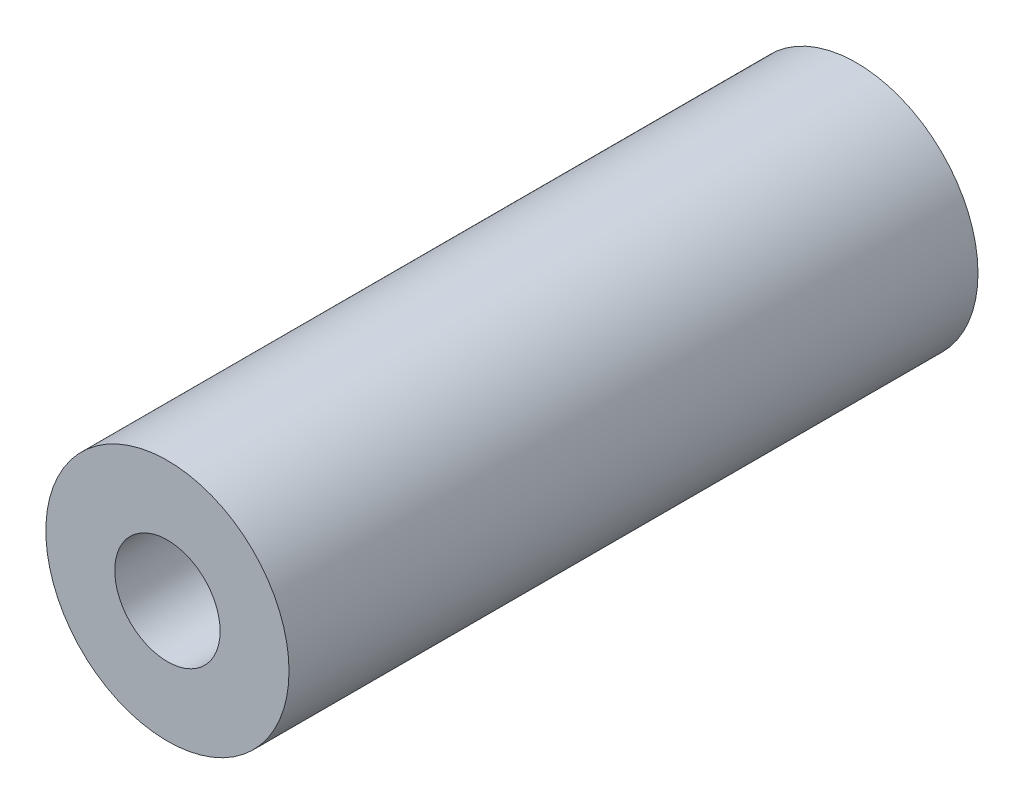
ISO-10303-21;
HEADER;
FILE_DESCRIPTION(('STEP AP214'),'2;1');
FILE_NAME('part.step','',(''),(''),'','','');
FILE_SCHEMA(('AUTOMOTIVE_DESIGN { 1 0 10303 214 1 1 1 1 }'));
ENDSEC;
DATA;
#1=APPLICATION_CONTEXT('core data for automotive mechanical design processes');
#2=APPLICATION_PROTOCOL_DEFINITION('international standard','automotive_design',2000,#1);
#3=PRODUCT_CONTEXT('',#1,'mechanical');
#4=PRODUCT('Part','Part','',(#3));
#5=PRODUCT_RELATED_PRODUCT_CATEGORY('part','',(#4));
#6=PRODUCT_DEFINITION_FORMATION('','',#4);
#7=PRODUCT_DEFINITION_CONTEXT('part definition',#1,'design');
#8=PRODUCT_DEFINITION('design','',#6,#7);
#9=PRODUCT_DEFINITION_SHAPE('','',#8);
#10=(LENGTH_UNIT() NAMED_UNIT(*) SI_UNIT(.MILLI.,.METRE.));
#11=(NAMED_UNIT(*) PLANE_ANGLE_UNIT() SI_UNIT($,.RADIAN.));
#12=(NAMED_UNIT(*) SI_UNIT($,.STERADIAN.) SOLID_ANGLE_UNIT());
#13=UNCERTAINTY_MEASURE_WITH_UNIT(LENGTH_MEASURE(1.E-05),#10,'distance_accuracy_value','');
#14=(GEOMETRIC_REPRESENTATION_CONTEXT(3) GLOBAL_UNCERTAINTY_ASSIGNED_CONTEXT((#13)) GLOBAL_UNIT_ASSIGNED_CONTEXT((#10,
#11,#12)) REPRESENTATION_CONTEXT('',''));
#15=CARTESIAN_POINT('',(0.,0.,0.));
#16=DIRECTION('',(0.,0.,1.));
#17=DIRECTION('',(1.,0.,0.));
#18=AXIS2_PLACEMENT_3D('',#15,#16,#17);
#19=CARTESIAN_POINT('',(0.,0.,17.));
#20=DIRECTION('',(0.,0.,1.));
#21=DIRECTION('',(1.,0.,0.));
#22=AXIS2_PLACEMENT_3D('',#19,#20,#21);
#23=PLANE('',#22);
#24=CARTESIAN_POINT('',(0.,0.,17.));
#25=DIRECTION('',(0.,0.,1.));
#26=DIRECTION('',(1.,0.,0.));
#27=AXIS2_PLACEMENT_3D('',#24,#25,#26);
#28=CIRCLE('',#27,3.);
#29=CARTESIAN_POINT('',(3.,0.,17.));
#30=VERTEX_POINT('',#29);
#31=EDGE_CURVE('E10',#30,#30,#28,.T.);
#32=ORIENTED_EDGE('',*,*,#31,.T.);
#33=EDGE_LOOP('',(#32));
#34=FACE_BOUND('',#33,.T.);
#35=CARTESIAN_POINT('',(0.,0.,17.));
#36=DIRECTION('',(0.,0.,1.));
#37=DIRECTION('',(1.,0.,0.));
#38=AXIS2_PLACEMENT_3D('',#35,#36,#37);
#39=CIRCLE('',#38,1.3);
#40=CARTESIAN_POINT('',(1.3,0.,17.));
#41=VERTEX_POINT('',#40);
#42=EDGE_CURVE('E44',#41,#41,#39,.T.);
#43=ORIENTED_EDGE('',*,*,#42,.F.);
#44=EDGE_LOOP('',(#43));
#45=FACE_BOUND('',#44,.T.);
#46=ADVANCED_FACE('F33',(#34,#45),#23,.T.);
#47=CARTESIAN_POINT('',(0.,0.,0.));
#48=DIRECTION('',(0.,0.,1.));
#49=DIRECTION('',(1.,0.,0.));
#50=AXIS2_PLACEMENT_3D('',#47,#48,#49);
#51=PLANE('',#50);
#52=CARTESIAN_POINT('',(0.,0.,0.));
#53=DIRECTION('',(0.,0.,1.));
#54=DIRECTION('',(1.,0.,0.));
#55=AXIS2_PLACEMENT_3D('',#52,#53,#54);
#56=CIRCLE('',#55,3.);
#57=CARTESIAN_POINT('',(3.,0.,0.));
#58=VERTEX_POINT('',#57);
#59=EDGE_CURVE('E37',#58,#58,#56,.T.);
#60=ORIENTED_EDGE('',*,*,#59,.F.);
#61=EDGE_LOOP('',(#60));
#62=FACE_BOUND('',#61,.T.);
#63=CARTESIAN_POINT('',(0.,0.,0.));
#64=DIRECTION('',(0.,0.,1.));
#65=DIRECTION('',(1.,0.,0.));
#66=AXIS2_PLACEMENT_3D('',#63,#64,#65);
#67=CIRCLE('',#66,1.3);
#68=CARTESIAN_POINT('',(1.3,0.,0.));
#69=VERTEX_POINT('',#68);
#70=EDGE_CURVE('E46',#69,#69,#67,.T.);
#71=ORIENTED_EDGE('',*,*,#70,.T.);
#72=EDGE_LOOP('',(#71));
#73=FACE_BOUND('',#72,.T.);
#74=ADVANCED_FACE('F56',(#62,#73),#51,.F.);
#75=CARTESIAN_POINT('',(0.,0.,17.));
#76=DIRECTION('',(0.,0.,-1.));
#77=DIRECTION('',(-1.,0.,0.));
#78=AXIS2_PLACEMENT_3D('',#75,#76,#77);
#79=CYLINDRICAL_SURFACE('',#78,3.);
#80=ORIENTED_EDGE('',*,*,#31,.F.);
#81=EDGE_LOOP('',(#80));
#82=FACE_BOUND('',#81,.T.);
#83=ORIENTED_EDGE('',*,*,#59,.T.);
#84=EDGE_LOOP('',(#83));
#85=FACE_BOUND('',#84,.T.);
#86=ADVANCED_FACE('F35',(#82,#85),#79,.T.);
#87=CARTESIAN_POINT('',(0.,0.,17.));
#88=DIRECTION('',(0.,0.,-1.));
#89=DIRECTION('',(-1.,0.,0.));
#90=AXIS2_PLACEMENT_3D('',#87,#88,#89);
#91=CYLINDRICAL_SURFACE('',#90,1.3);
#92=ORIENTED_EDGE('',*,*,#42,.T.);
#93=EDGE_LOOP('',(#92));
#94=FACE_BOUND('',#93,.T.);
#95=ORIENTED_EDGE('',*,*,#70,.F.);
#96=EDGE_LOOP('',(#95));
#97=FACE_BOUND('',#96,.T.);
#98=ADVANCED_FACE('F52',(#94,#97),#91,.F.);
#99=CLOSED_SHELL('',(#46,#74,#86,#98));
#100=MANIFOLD_SOLID_BREP('B2',#99);
#101=ADVANCED_BREP_SHAPE_REPRESENTATION('',(#18,#100),#14);
#102=SHAPE_DEFINITION_REPRESENTATION(#9,#101);
ENDSEC;
END-ISO-10303-21;
